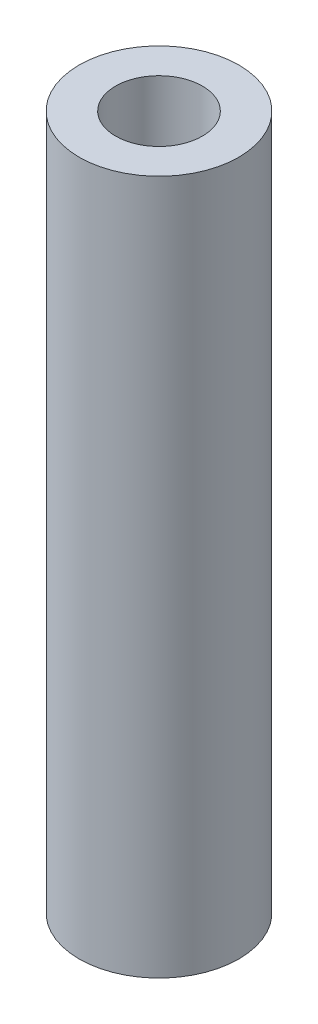
ISO-10303-21;
HEADER;
FILE_DESCRIPTION(('STEP AP214'),'2;1');
FILE_NAME('part.step','',(''),(''),'','','');
FILE_SCHEMA(('AUTOMOTIVE_DESIGN { 1 0 10303 214 1 1 1 1 }'));
ENDSEC;
DATA;
#1=APPLICATION_CONTEXT('core data for automotive mechanical design processes');
#2=APPLICATION_PROTOCOL_DEFINITION('international standard','automotive_design',2000,#1);
#3=PRODUCT_CONTEXT('',#1,'mechanical');
#4=PRODUCT('Part','Part','',(#3));
#5=PRODUCT_RELATED_PRODUCT_CATEGORY('part','',(#4));
#6=PRODUCT_DEFINITION_FORMATION('','',#4);
#7=PRODUCT_DEFINITION_CONTEXT('part definition',#1,'design');
#8=PRODUCT_DEFINITION('design','',#6,#7);
#9=PRODUCT_DEFINITION_SHAPE('','',#8);
#10=(LENGTH_UNIT() NAMED_UNIT(*) SI_UNIT(.MILLI.,.METRE.));
#11=(NAMED_UNIT(*) PLANE_ANGLE_UNIT() SI_UNIT($,.RADIAN.));
#12=(NAMED_UNIT(*) SI_UNIT($,.STERADIAN.) SOLID_ANGLE_UNIT());
#13=UNCERTAINTY_MEASURE_WITH_UNIT(LENGTH_MEASURE(1.E-05),#10,'distance_accuracy_value','');
#14=(GEOMETRIC_REPRESENTATION_CONTEXT(3) GLOBAL_UNCERTAINTY_ASSIGNED_CONTEXT((#13)) GLOBAL_UNIT_ASSIGNED_CONTEXT((#10,
#11,#12)) REPRESENTATION_CONTEXT('',''));
#15=CARTESIAN_POINT('',(0.,0.,0.));
#16=DIRECTION('',(0.,0.,1.));
#17=DIRECTION('',(1.,0.,0.));
#18=AXIS2_PLACEMENT_3D('',#15,#16,#17);
#19=CARTESIAN_POINT('',(0.,20.,0.));
#20=DIRECTION('',(0.,1.,0.));
#21=DIRECTION('',(0.,0.,1.));
#22=AXIS2_PLACEMENT_3D('',#19,#20,#21);
#23=PLANE('',#22);
#24=CARTESIAN_POINT('',(0.,20.,0.));
#25=DIRECTION('',(0.,1.,0.));
#26=DIRECTION('',(0.,0.,1.));
#27=AXIS2_PLACEMENT_3D('',#24,#25,#26);
#28=CIRCLE('',#27,2.3);
#29=CARTESIAN_POINT('',(0.,20.,2.3));
#30=VERTEX_POINT('',#29);
#31=EDGE_CURVE('E10',#30,#30,#28,.T.);
#32=ORIENTED_EDGE('',*,*,#31,.T.);
#33=EDGE_LOOP('',(#32));
#34=FACE_BOUND('',#33,.T.);
#35=CARTESIAN_POINT('',(0.,20.,0.));
#36=DIRECTION('',(0.,1.,0.));
#37=DIRECTION('',(0.,0.,1.));
#38=AXIS2_PLACEMENT_3D('',#35,#36,#37);
#39=CIRCLE('',#38,1.25);
#40=CARTESIAN_POINT('',(0.,20.,1.25));
#41=VERTEX_POINT('',#40);
#42=EDGE_CURVE('E44',#41,#41,#39,.T.);
#43=ORIENTED_EDGE('',*,*,#42,.F.);
#44=EDGE_LOOP('',(#43));
#45=FACE_BOUND('',#44,.T.);
#46=ADVANCED_FACE('F33',(#34,#45),#23,.T.);
#47=CARTESIAN_POINT('',(0.,0.,0.));
#48=DIRECTION('',(0.,1.,0.));
#49=DIRECTION('',(0.,0.,1.));
#50=AXIS2_PLACEMENT_3D('',#47,#48,#49);
#51=PLANE('',#50);
#52=CARTESIAN_POINT('',(0.,0.,0.));
#53=DIRECTION('',(0.,1.,0.));
#54=DIRECTION('',(0.,0.,1.));
#55=AXIS2_PLACEMENT_3D('',#52,#53,#54);
#56=CIRCLE('',#55,2.3);
#57=CARTESIAN_POINT('',(0.,0.,2.3));
#58=VERTEX_POINT('',#57);
#59=EDGE_CURVE('E37',#58,#58,#56,.T.);
#60=ORIENTED_EDGE('',*,*,#59,.F.);
#61=EDGE_LOOP('',(#60));
#62=FACE_BOUND('',#61,.T.);
#63=CARTESIAN_POINT('',(0.,0.,0.));
#64=DIRECTION('',(0.,1.,0.));
#65=DIRECTION('',(0.,0.,1.));
#66=AXIS2_PLACEMENT_3D('',#63,#64,#65);
#67=CIRCLE('',#66,1.25);
#68=CARTESIAN_POINT('',(0.,0.,1.25));
#69=VERTEX_POINT('',#68);
#70=EDGE_CURVE('E46',#69,#69,#67,.T.);
#71=ORIENTED_EDGE('',*,*,#70,.T.);
#72=EDGE_LOOP('',(#71));
#73=FACE_BOUND('',#72,.T.);
#74=ADVANCED_FACE('F56',(#62,#73),#51,.F.);
#75=CARTESIAN_POINT('',(0.,20.,0.));
#76=DIRECTION('',(0.,-1.,0.));
#77=DIRECTION('',(0.,0.,-1.));
#78=AXIS2_PLACEMENT_3D('',#75,#76,#77);
#79=CYLINDRICAL_SURFACE('',#78,2.3);
#80=ORIENTED_EDGE('',*,*,#31,.F.);
#81=EDGE_LOOP('',(#80));
#82=FACE_BOUND('',#81,.T.);
#83=ORIENTED_EDGE('',*,*,#59,.T.);
#84=EDGE_LOOP('',(#83));
#85=FACE_BOUND('',#84,.T.);
#86=ADVANCED_FACE('F35',(#82,#85),#79,.T.);
#87=CARTESIAN_POINT('',(0.,20.,0.));
#88=DIRECTION('',(0.,-1.,0.));
#89=DIRECTION('',(0.,0.,-1.));
#90=AXIS2_PLACEMENT_3D('',#87,#88,#89);
#91=CYLINDRICAL_SURFACE('',#90,1.25);
#92=ORIENTED_EDGE('',*,*,#42,.T.);
#93=EDGE_LOOP('',(#92));
#94=FACE_BOUND('',#93,.T.);
#95=ORIENTED_EDGE('',*,*,#70,.F.);
#96=EDGE_LOOP('',(#95));
#97=FACE_BOUND('',#96,.T.);
#98=ADVANCED_FACE('F52',(#94,#97),#91,.F.);
#99=CLOSED_SHELL('',(#46,#74,#86,#98));
#100=MANIFOLD_SOLID_BREP('B2',#99);
#101=ADVANCED_BREP_SHAPE_REPRESENTATION('',(#18,#100),#14);
#102=SHAPE_DEFINITION_REPRESENTATION(#9,#101);
ENDSEC;
END-ISO-10303-21;
